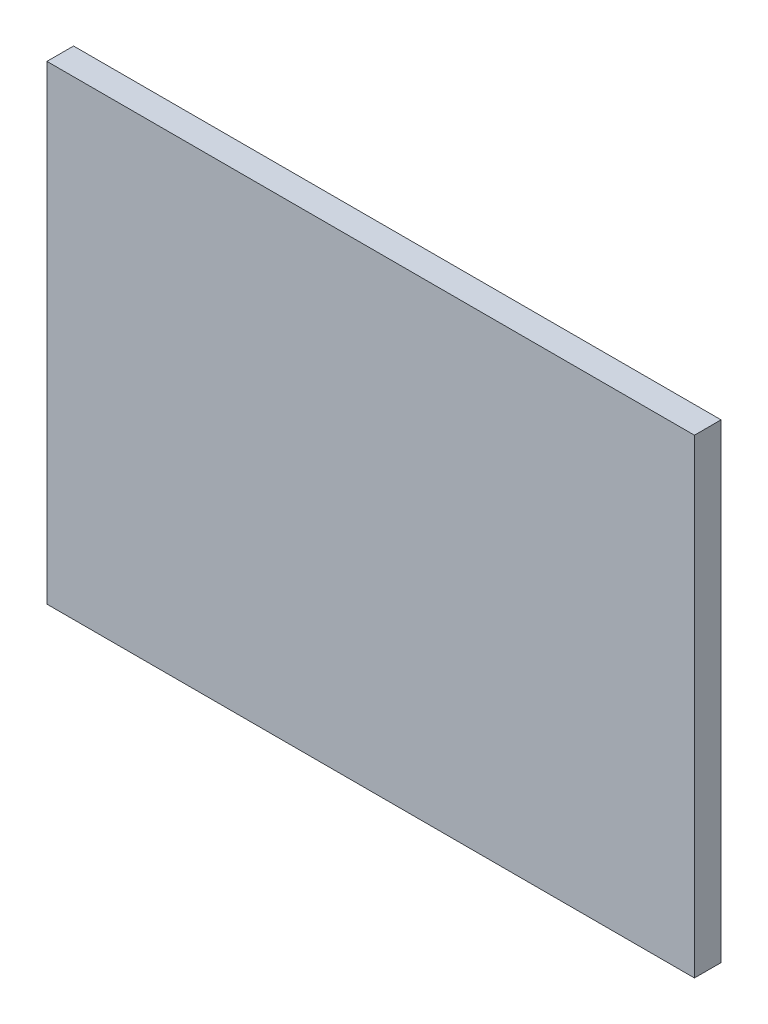
ISO-10303-21;
HEADER;
FILE_DESCRIPTION(('STEP AP214'),'2;1');
FILE_NAME('part.step','',(''),(''),'','','');
FILE_SCHEMA(('AUTOMOTIVE_DESIGN { 1 0 10303 214 1 1 1 1 }'));
ENDSEC;
DATA;
#1=APPLICATION_CONTEXT('core data for automotive mechanical design processes');
#2=APPLICATION_PROTOCOL_DEFINITION('international standard','automotive_design',2000,#1);
#3=PRODUCT_CONTEXT('',#1,'mechanical');
#4=PRODUCT('Part','Part','',(#3));
#5=PRODUCT_RELATED_PRODUCT_CATEGORY('part','',(#4));
#6=PRODUCT_DEFINITION_FORMATION('','',#4);
#7=PRODUCT_DEFINITION_CONTEXT('part definition',#1,'design');
#8=PRODUCT_DEFINITION('design','',#6,#7);
#9=PRODUCT_DEFINITION_SHAPE('','',#8);
#10=(LENGTH_UNIT() NAMED_UNIT(*) SI_UNIT(.MILLI.,.METRE.));
#11=(NAMED_UNIT(*) PLANE_ANGLE_UNIT() SI_UNIT($,.RADIAN.));
#12=(NAMED_UNIT(*) SI_UNIT($,.STERADIAN.) SOLID_ANGLE_UNIT());
#13=UNCERTAINTY_MEASURE_WITH_UNIT(LENGTH_MEASURE(1.E-05),#10,'distance_accuracy_value','');
#14=(GEOMETRIC_REPRESENTATION_CONTEXT(3) GLOBAL_UNCERTAINTY_ASSIGNED_CONTEXT((#13)) GLOBAL_UNIT_ASSIGNED_CONTEXT((#10,
#11,#12)) REPRESENTATION_CONTEXT('',''));
#15=CARTESIAN_POINT('',(0.,0.,0.));
#16=DIRECTION('',(0.,0.,1.));
#17=DIRECTION('',(1.,0.,0.));
#18=AXIS2_PLACEMENT_3D('',#15,#16,#17);
#19=CARTESIAN_POINT('',(-36.5,26.5,3.));
#20=DIRECTION('',(1.,0.,0.));
#21=DIRECTION('',(0.,1.,0.));
#22=AXIS2_PLACEMENT_3D('',#19,#20,#21);
#23=PLANE('',#22);
#24=DIRECTION('',(0.,-1.,0.));
#25=VECTOR('',#24,1.);
#26=CARTESIAN_POINT('',(-36.5,26.5,0.));
#27=LINE('',#26,#25);
#28=CARTESIAN_POINT('',(-36.5,26.5,0.));
#29=VERTEX_POINT('',#28);
#30=CARTESIAN_POINT('',(-36.5,-26.5,0.));
#31=VERTEX_POINT('',#30);
#32=EDGE_CURVE('E102',#29,#31,#27,.T.);
#33=ORIENTED_EDGE('',*,*,#32,.T.);
#34=DIRECTION('',(0.,0.,-1.));
#35=VECTOR('',#34,1.);
#36=CARTESIAN_POINT('',(-36.5,-26.5,3.));
#37=LINE('',#36,#35);
#38=CARTESIAN_POINT('',(-36.5,-26.5,3.));
#39=VERTEX_POINT('',#38);
#40=EDGE_CURVE('E11',#39,#31,#37,.T.);
#41=ORIENTED_EDGE('',*,*,#40,.F.);
#42=DIRECTION('',(0.,-1.,0.));
#43=VECTOR('',#42,1.);
#44=CARTESIAN_POINT('',(-36.5,26.5,3.));
#45=LINE('',#44,#43);
#46=CARTESIAN_POINT('',(-36.5,26.5,3.));
#47=VERTEX_POINT('',#46);
#48=EDGE_CURVE('E90',#47,#39,#45,.T.);
#49=ORIENTED_EDGE('',*,*,#48,.F.);
#50=DIRECTION('',(0.,0.,-1.));
#51=VECTOR('',#50,1.);
#52=CARTESIAN_POINT('',(-36.5,26.5,3.));
#53=LINE('',#52,#51);
#54=EDGE_CURVE('E98',#47,#29,#53,.T.);
#55=ORIENTED_EDGE('',*,*,#54,.T.);
#56=EDGE_LOOP('',(#33,#41,#49,#55));
#57=FACE_BOUND('',#56,.T.);
#58=ADVANCED_FACE('F39',(#57),#23,.F.);
#59=CARTESIAN_POINT('',(36.5,-26.5,3.));
#60=DIRECTION('',(0.,1.,0.));
#61=DIRECTION('',(-1.,0.,0.));
#62=AXIS2_PLACEMENT_3D('',#59,#60,#61);
#63=PLANE('',#62);
#64=DIRECTION('',(1.,0.,0.));
#65=VECTOR('',#64,1.);
#66=CARTESIAN_POINT('',(36.5,-26.5,0.));
#67=LINE('',#66,#65);
#68=CARTESIAN_POINT('',(36.5,-26.5,0.));
#69=VERTEX_POINT('',#68);
#70=EDGE_CURVE('E94',#31,#69,#67,.T.);
#71=ORIENTED_EDGE('',*,*,#70,.T.);
#72=DIRECTION('',(0.,0.,-1.));
#73=VECTOR('',#72,1.);
#74=CARTESIAN_POINT('',(36.5,-26.5,3.));
#75=LINE('',#74,#73);
#76=CARTESIAN_POINT('',(36.5,-26.5,3.));
#77=VERTEX_POINT('',#76);
#78=EDGE_CURVE('E47',#77,#69,#75,.T.);
#79=ORIENTED_EDGE('',*,*,#78,.F.);
#80=DIRECTION('',(1.,0.,0.));
#81=VECTOR('',#80,1.);
#82=CARTESIAN_POINT('',(36.5,-26.5,3.));
#83=LINE('',#82,#81);
#84=EDGE_CURVE('E85',#39,#77,#83,.T.);
#85=ORIENTED_EDGE('',*,*,#84,.F.);
#86=ORIENTED_EDGE('',*,*,#40,.T.);
#87=EDGE_LOOP('',(#71,#79,#85,#86));
#88=FACE_BOUND('',#87,.T.);
#89=ADVANCED_FACE('F93',(#88),#63,.F.);
#90=CARTESIAN_POINT('',(36.5,26.5,3.));
#91=DIRECTION('',(-1.,0.,0.));
#92=DIRECTION('',(0.,-1.,0.));
#93=AXIS2_PLACEMENT_3D('',#90,#91,#92);
#94=PLANE('',#93);
#95=DIRECTION('',(0.,1.,0.));
#96=VECTOR('',#95,1.);
#97=CARTESIAN_POINT('',(36.5,26.5,0.));
#98=LINE('',#97,#96);
#99=CARTESIAN_POINT('',(36.5,26.5,0.));
#100=VERTEX_POINT('',#99);
#101=EDGE_CURVE('E72',#69,#100,#98,.T.);
#102=ORIENTED_EDGE('',*,*,#101,.T.);
#103=DIRECTION('',(0.,0.,-1.));
#104=VECTOR('',#103,1.);
#105=CARTESIAN_POINT('',(36.5,26.5,3.));
#106=LINE('',#105,#104);
#107=CARTESIAN_POINT('',(36.5,26.5,3.));
#108=VERTEX_POINT('',#107);
#109=EDGE_CURVE('E95',#108,#100,#106,.T.);
#110=ORIENTED_EDGE('',*,*,#109,.F.);
#111=DIRECTION('',(0.,1.,0.));
#112=VECTOR('',#111,1.);
#113=CARTESIAN_POINT('',(36.5,26.5,3.));
#114=LINE('',#113,#112);
#115=EDGE_CURVE('E88',#77,#108,#114,.T.);
#116=ORIENTED_EDGE('',*,*,#115,.F.);
#117=ORIENTED_EDGE('',*,*,#78,.T.);
#118=EDGE_LOOP('',(#102,#110,#116,#117));
#119=FACE_BOUND('',#118,.T.);
#120=ADVANCED_FACE('F96',(#119),#94,.F.);
#121=CARTESIAN_POINT('',(36.5,26.5,3.));
#122=DIRECTION('',(0.,-1.,0.));
#123=DIRECTION('',(1.,0.,0.));
#124=AXIS2_PLACEMENT_3D('',#121,#122,#123);
#125=PLANE('',#124);
#126=DIRECTION('',(-1.,0.,0.));
#127=VECTOR('',#126,1.);
#128=CARTESIAN_POINT('',(36.5,26.5,0.));
#129=LINE('',#128,#127);
#130=EDGE_CURVE('E78',#100,#29,#129,.T.);
#131=ORIENTED_EDGE('',*,*,#130,.T.);
#132=ORIENTED_EDGE('',*,*,#54,.F.);
#133=DIRECTION('',(-1.,0.,0.));
#134=VECTOR('',#133,1.);
#135=CARTESIAN_POINT('',(36.5,26.5,3.));
#136=LINE('',#135,#134);
#137=EDGE_CURVE('E55',#108,#47,#136,.T.);
#138=ORIENTED_EDGE('',*,*,#137,.F.);
#139=ORIENTED_EDGE('',*,*,#109,.T.);
#140=EDGE_LOOP('',(#131,#132,#138,#139));
#141=FACE_BOUND('',#140,.T.);
#142=ADVANCED_FACE('F109',(#141),#125,.F.);
#143=CARTESIAN_POINT('',(0.,0.,3.));
#144=DIRECTION('',(0.,0.,-1.));
#145=DIRECTION('',(-1.,0.,0.));
#146=AXIS2_PLACEMENT_3D('',#143,#144,#145);
#147=PLANE('',#146);
#148=ORIENTED_EDGE('',*,*,#48,.T.);
#149=ORIENTED_EDGE('',*,*,#84,.T.);
#150=ORIENTED_EDGE('',*,*,#115,.T.);
#151=ORIENTED_EDGE('',*,*,#137,.T.);
#152=EDGE_LOOP('',(#148,#149,#150,#151));
#153=FACE_BOUND('',#152,.T.);
#154=ADVANCED_FACE('F86',(#153),#147,.F.);
#155=CARTESIAN_POINT('',(0.,0.,0.));
#156=DIRECTION('',(0.,0.,-1.));
#157=DIRECTION('',(-1.,0.,0.));
#158=AXIS2_PLACEMENT_3D('',#155,#156,#157);
#159=PLANE('',#158);
#160=ORIENTED_EDGE('',*,*,#32,.F.);
#161=ORIENTED_EDGE('',*,*,#130,.F.);
#162=ORIENTED_EDGE('',*,*,#101,.F.);
#163=ORIENTED_EDGE('',*,*,#70,.F.);
#164=EDGE_LOOP('',(#160,#161,#162,#163));
#165=FACE_BOUND('',#164,.T.);
#166=ADVANCED_FACE('F112',(#165),#159,.T.);
#167=CLOSED_SHELL('',(#58,#89,#120,#142,#154,#166));
#168=MANIFOLD_SOLID_BREP('B2',#167);
#169=ADVANCED_BREP_SHAPE_REPRESENTATION('',(#18,#168),#14);
#170=SHAPE_DEFINITION_REPRESENTATION(#9,#169);
ENDSEC;
END-ISO-10303-21;
